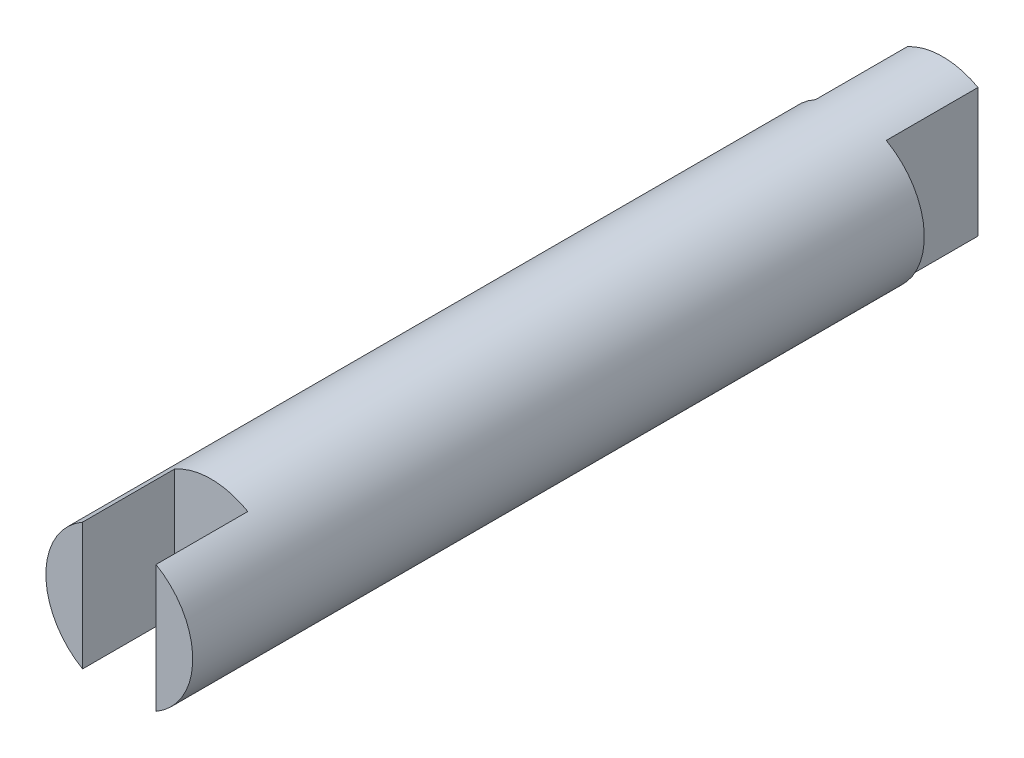
ISO-10303-21;
HEADER;
FILE_DESCRIPTION(('STEP AP214'),'2;1');
FILE_NAME('part.step','',(''),(''),'','','');
FILE_SCHEMA(('AUTOMOTIVE_DESIGN { 1 0 10303 214 1 1 1 1 }'));
ENDSEC;
DATA;
#1=APPLICATION_CONTEXT('core data for automotive mechanical design processes');
#2=APPLICATION_PROTOCOL_DEFINITION('international standard','automotive_design',2000,#1);
#3=PRODUCT_CONTEXT('',#1,'mechanical');
#4=PRODUCT('Part','Part','',(#3));
#5=PRODUCT_RELATED_PRODUCT_CATEGORY('part','',(#4));
#6=PRODUCT_DEFINITION_FORMATION('','',#4);
#7=PRODUCT_DEFINITION_CONTEXT('part definition',#1,'design');
#8=PRODUCT_DEFINITION('design','',#6,#7);
#9=PRODUCT_DEFINITION_SHAPE('','',#8);
#10=(LENGTH_UNIT() NAMED_UNIT(*) SI_UNIT(.MILLI.,.METRE.));
#11=(NAMED_UNIT(*) PLANE_ANGLE_UNIT() SI_UNIT($,.RADIAN.));
#12=(NAMED_UNIT(*) SI_UNIT($,.STERADIAN.) SOLID_ANGLE_UNIT());
#13=UNCERTAINTY_MEASURE_WITH_UNIT(LENGTH_MEASURE(1.E-05),#10,'distance_accuracy_value','');
#14=(GEOMETRIC_REPRESENTATION_CONTEXT(3) GLOBAL_UNCERTAINTY_ASSIGNED_CONTEXT((#13)) GLOBAL_UNIT_ASSIGNED_CONTEXT((#10,
#11,#12)) REPRESENTATION_CONTEXT('',''));
#15=CARTESIAN_POINT('',(0.,0.,0.));
#16=DIRECTION('',(0.,0.,1.));
#17=DIRECTION('',(1.,0.,0.));
#18=AXIS2_PLACEMENT_3D('',#15,#16,#17);
#19=CARTESIAN_POINT('',(0.,0.,0.));
#20=DIRECTION('',(0.,0.,1.));
#21=DIRECTION('',(1.,0.,0.));
#22=AXIS2_PLACEMENT_3D('',#19,#20,#21);
#23=PLANE('',#22);
#24=CARTESIAN_POINT('',(0.,0.,0.));
#25=DIRECTION('',(0.,0.,1.));
#26=DIRECTION('',(1.,0.,0.));
#27=AXIS2_PLACEMENT_3D('',#24,#25,#26);
#28=CIRCLE('',#27,4.);
#29=CARTESIAN_POINT('',(-2.,-3.46410161513775,0.));
#30=VERTEX_POINT('',#29);
#31=CARTESIAN_POINT('',(2.,-3.46410161513775,0.));
#32=VERTEX_POINT('',#31);
#33=EDGE_CURVE('E49',#30,#32,#28,.T.);
#34=ORIENTED_EDGE('',*,*,#33,.T.);
#35=DIRECTION('',(0.,-1.,0.));
#36=VECTOR('',#35,1.);
#37=CARTESIAN_POINT('',(2.,3.46410161513775,0.));
#38=LINE('',#37,#36);
#39=CARTESIAN_POINT('',(2.,3.46410161513775,0.));
#40=VERTEX_POINT('',#39);
#41=EDGE_CURVE('E128',#40,#32,#38,.T.);
#42=ORIENTED_EDGE('',*,*,#41,.F.);
#43=CARTESIAN_POINT('',(-2.,3.46410161513775,0.));
#44=VERTEX_POINT('',#43);
#45=EDGE_CURVE('E166',#40,#44,#28,.T.);
#46=ORIENTED_EDGE('',*,*,#45,.T.);
#47=DIRECTION('',(0.,1.,0.));
#48=VECTOR('',#47,1.);
#49=CARTESIAN_POINT('',(-2.,3.46410161513775,0.));
#50=LINE('',#49,#48);
#51=EDGE_CURVE('E153',#30,#44,#50,.T.);
#52=ORIENTED_EDGE('',*,*,#51,.F.);
#53=EDGE_LOOP('',(#34,#42,#46,#52));
#54=FACE_BOUND('',#53,.T.);
#55=ADVANCED_FACE('F45',(#54),#23,.T.);
#56=CARTESIAN_POINT('',(0.,0.,-39.85));
#57=DIRECTION('',(0.,0.,1.));
#58=DIRECTION('',(1.,0.,0.));
#59=AXIS2_PLACEMENT_3D('',#56,#57,#58);
#60=CYLINDRICAL_SURFACE('',#59,4.);
#61=DIRECTION('',(0.,0.,-1.));
#62=VECTOR('',#61,1.);
#63=CARTESIAN_POINT('',(1.925,-3.50633355515416,-34.85));
#64=LINE('',#63,#62);
#65=CARTESIAN_POINT('',(1.925,-3.50633355515416,-34.85));
#66=VERTEX_POINT('',#65);
#67=CARTESIAN_POINT('',(1.925,-3.50633355515416,-39.85));
#68=VERTEX_POINT('',#67);
#69=EDGE_CURVE('E61',#66,#68,#64,.T.);
#70=ORIENTED_EDGE('',*,*,#69,.F.);
#71=CARTESIAN_POINT('',(0.,0.,-34.85));
#72=DIRECTION('',(0.,0.,-1.));
#73=DIRECTION('',(-1.,0.,0.));
#74=AXIS2_PLACEMENT_3D('',#71,#72,#73);
#75=CIRCLE('',#74,4.);
#76=CARTESIAN_POINT('',(1.925,3.50633355515416,-34.85));
#77=VERTEX_POINT('',#76);
#78=EDGE_CURVE('E113',#77,#66,#75,.T.);
#79=ORIENTED_EDGE('',*,*,#78,.F.);
#80=DIRECTION('',(0.,0.,-1.));
#81=VECTOR('',#80,1.);
#82=CARTESIAN_POINT('',(1.925,3.50633355515416,-34.85));
#83=LINE('',#82,#81);
#84=CARTESIAN_POINT('',(1.925,3.50633355515416,-39.85));
#85=VERTEX_POINT('',#84);
#86=EDGE_CURVE('E121',#77,#85,#83,.T.);
#87=ORIENTED_EDGE('',*,*,#86,.T.);
#88=CARTESIAN_POINT('',(0.,0.,-39.85));
#89=DIRECTION('',(0.,0.,1.));
#90=DIRECTION('',(1.,0.,0.));
#91=AXIS2_PLACEMENT_3D('',#88,#89,#90);
#92=CIRCLE('',#91,4.);
#93=CARTESIAN_POINT('',(-1.925,3.50633355515416,-39.85));
#94=VERTEX_POINT('',#93);
#95=EDGE_CURVE('E12',#85,#94,#92,.T.);
#96=ORIENTED_EDGE('',*,*,#95,.T.);
#97=DIRECTION('',(0.,0.,-1.));
#98=VECTOR('',#97,1.);
#99=CARTESIAN_POINT('',(-1.925,3.50633355515416,-34.85));
#100=LINE('',#99,#98);
#101=CARTESIAN_POINT('',(-1.925,3.50633355515416,-34.85));
#102=VERTEX_POINT('',#101);
#103=EDGE_CURVE('E69',#102,#94,#100,.T.);
#104=ORIENTED_EDGE('',*,*,#103,.F.);
#105=CARTESIAN_POINT('',(0.,0.,-34.85));
#106=DIRECTION('',(0.,0.,-1.));
#107=DIRECTION('',(-1.,0.,0.));
#108=AXIS2_PLACEMENT_3D('',#105,#106,#107);
#109=CIRCLE('',#108,4.);
#110=CARTESIAN_POINT('',(-1.925,-3.50633355515416,-34.85));
#111=VERTEX_POINT('',#110);
#112=EDGE_CURVE('E138',#111,#102,#109,.T.);
#113=ORIENTED_EDGE('',*,*,#112,.F.);
#114=DIRECTION('',(0.,0.,-1.));
#115=VECTOR('',#114,1.);
#116=CARTESIAN_POINT('',(-1.925,-3.50633355515416,-34.85));
#117=LINE('',#116,#115);
#118=CARTESIAN_POINT('',(-1.925,-3.50633355515416,-39.85));
#119=VERTEX_POINT('',#118);
#120=EDGE_CURVE('E134',#111,#119,#117,.T.);
#121=ORIENTED_EDGE('',*,*,#120,.T.);
#122=EDGE_CURVE('E54',#119,#68,#92,.T.);
#123=ORIENTED_EDGE('',*,*,#122,.T.);
#124=EDGE_LOOP('',(#70,#79,#87,#96,#104,#113,#121,#123));
#125=FACE_BOUND('',#124,.T.);
#126=ORIENTED_EDGE('',*,*,#33,.F.);
#127=DIRECTION('',(0.,0.,-1.));
#128=VECTOR('',#127,1.);
#129=CARTESIAN_POINT('',(-2.,-3.46410161513775,5.));
#130=LINE('',#129,#128);
#131=CARTESIAN_POINT('',(-2.,-3.46410161513775,5.));
#132=VERTEX_POINT('',#131);
#133=EDGE_CURVE('E164',#132,#30,#130,.T.);
#134=ORIENTED_EDGE('',*,*,#133,.F.);
#135=CARTESIAN_POINT('',(0.,0.,5.));
#136=DIRECTION('',(0.,0.,1.));
#137=DIRECTION('',(1.,0.,0.));
#138=AXIS2_PLACEMENT_3D('',#135,#136,#137);
#139=CIRCLE('',#138,4.);
#140=CARTESIAN_POINT('',(-2.,3.46410161513775,5.));
#141=VERTEX_POINT('',#140);
#142=EDGE_CURVE('E154',#141,#132,#139,.T.);
#143=ORIENTED_EDGE('',*,*,#142,.F.);
#144=DIRECTION('',(0.,0.,-1.));
#145=VECTOR('',#144,1.);
#146=CARTESIAN_POINT('',(-2.,3.46410161513775,5.));
#147=LINE('',#146,#145);
#148=EDGE_CURVE('E159',#141,#44,#147,.T.);
#149=ORIENTED_EDGE('',*,*,#148,.T.);
#150=ORIENTED_EDGE('',*,*,#45,.F.);
#151=DIRECTION('',(0.,0.,-1.));
#152=VECTOR('',#151,1.);
#153=CARTESIAN_POINT('',(2.,3.46410161513775,5.));
#154=LINE('',#153,#152);
#155=CARTESIAN_POINT('',(2.,3.46410161513775,5.));
#156=VERTEX_POINT('',#155);
#157=EDGE_CURVE('E151',#156,#40,#154,.T.);
#158=ORIENTED_EDGE('',*,*,#157,.F.);
#159=CARTESIAN_POINT('',(0.,0.,5.));
#160=DIRECTION('',(0.,0.,1.));
#161=DIRECTION('',(1.,0.,0.));
#162=AXIS2_PLACEMENT_3D('',#159,#160,#161);
#163=CIRCLE('',#162,4.);
#164=CARTESIAN_POINT('',(2.,-3.46410161513775,5.));
#165=VERTEX_POINT('',#164);
#166=EDGE_CURVE('E142',#165,#156,#163,.T.);
#167=ORIENTED_EDGE('',*,*,#166,.F.);
#168=DIRECTION('',(0.,0.,-1.));
#169=VECTOR('',#168,1.);
#170=CARTESIAN_POINT('',(2.,-3.46410161513775,5.));
#171=LINE('',#170,#169);
#172=EDGE_CURVE('E147',#165,#32,#171,.T.);
#173=ORIENTED_EDGE('',*,*,#172,.T.);
#174=EDGE_LOOP('',(#126,#134,#143,#149,#150,#158,#167,#173));
#175=FACE_BOUND('',#174,.T.);
#176=ADVANCED_FACE('F47',(#125,#175),#60,.T.);
#177=CARTESIAN_POINT('',(0.,0.,-39.85));
#178=DIRECTION('',(0.,0.,1.));
#179=DIRECTION('',(1.,0.,0.));
#180=AXIS2_PLACEMENT_3D('',#177,#178,#179);
#181=PLANE('',#180);
#182=ORIENTED_EDGE('',*,*,#95,.F.);
#183=DIRECTION('',(0.,1.,0.));
#184=VECTOR('',#183,1.);
#185=CARTESIAN_POINT('',(1.925,3.50633355515416,-39.85));
#186=LINE('',#185,#184);
#187=EDGE_CURVE('E118',#68,#85,#186,.T.);
#188=ORIENTED_EDGE('',*,*,#187,.F.);
#189=ORIENTED_EDGE('',*,*,#122,.F.);
#190=DIRECTION('',(0.,-1.,0.));
#191=VECTOR('',#190,1.);
#192=CARTESIAN_POINT('',(-1.925,3.50633355515416,-39.85));
#193=LINE('',#192,#191);
#194=EDGE_CURVE('E136',#94,#119,#193,.T.);
#195=ORIENTED_EDGE('',*,*,#194,.F.);
#196=EDGE_LOOP('',(#182,#188,#189,#195));
#197=FACE_BOUND('',#196,.T.);
#198=ADVANCED_FACE('F192',(#197),#181,.F.);
#199=CARTESIAN_POINT('',(-2.,3.46410161513775,5.));
#200=DIRECTION('',(-1.,0.,0.));
#201=DIRECTION('',(0.,0.,1.));
#202=AXIS2_PLACEMENT_3D('',#199,#200,#201);
#203=PLANE('',#202);
#204=ORIENTED_EDGE('',*,*,#51,.T.);
#205=ORIENTED_EDGE('',*,*,#148,.F.);
#206=DIRECTION('',(0.,1.,0.));
#207=VECTOR('',#206,1.);
#208=CARTESIAN_POINT('',(-2.,3.46410161513775,5.));
#209=LINE('',#208,#207);
#210=EDGE_CURVE('E157',#132,#141,#209,.T.);
#211=ORIENTED_EDGE('',*,*,#210,.F.);
#212=ORIENTED_EDGE('',*,*,#133,.T.);
#213=EDGE_LOOP('',(#204,#205,#211,#212));
#214=FACE_BOUND('',#213,.T.);
#215=ADVANCED_FACE('F181',(#214),#203,.F.);
#216=CARTESIAN_POINT('',(0.,0.,5.));
#217=DIRECTION('',(0.,0.,1.));
#218=DIRECTION('',(1.,0.,0.));
#219=AXIS2_PLACEMENT_3D('',#216,#217,#218);
#220=PLANE('',#219);
#221=ORIENTED_EDGE('',*,*,#142,.T.);
#222=ORIENTED_EDGE('',*,*,#210,.T.);
#223=EDGE_LOOP('',(#221,#222));
#224=FACE_BOUND('',#223,.T.);
#225=ADVANCED_FACE('F183',(#224),#220,.T.);
#226=CARTESIAN_POINT('',(2.,3.46410161513775,5.));
#227=DIRECTION('',(1.,0.,0.));
#228=DIRECTION('',(0.,0.,-1.));
#229=AXIS2_PLACEMENT_3D('',#226,#227,#228);
#230=PLANE('',#229);
#231=ORIENTED_EDGE('',*,*,#41,.T.);
#232=ORIENTED_EDGE('',*,*,#172,.F.);
#233=DIRECTION('',(0.,-1.,0.));
#234=VECTOR('',#233,1.);
#235=CARTESIAN_POINT('',(2.,3.46410161513775,5.));
#236=LINE('',#235,#234);
#237=EDGE_CURVE('E145',#156,#165,#236,.T.);
#238=ORIENTED_EDGE('',*,*,#237,.F.);
#239=ORIENTED_EDGE('',*,*,#157,.T.);
#240=EDGE_LOOP('',(#231,#232,#238,#239));
#241=FACE_BOUND('',#240,.T.);
#242=ADVANCED_FACE('F179',(#241),#230,.F.);
#243=CARTESIAN_POINT('',(0.,0.,5.));
#244=DIRECTION('',(0.,0.,1.));
#245=DIRECTION('',(1.,0.,0.));
#246=AXIS2_PLACEMENT_3D('',#243,#244,#245);
#247=PLANE('',#246);
#248=ORIENTED_EDGE('',*,*,#166,.T.);
#249=ORIENTED_EDGE('',*,*,#237,.T.);
#250=EDGE_LOOP('',(#248,#249));
#251=FACE_BOUND('',#250,.T.);
#252=ADVANCED_FACE('F190',(#251),#247,.T.);
#253=CARTESIAN_POINT('',(-1.925,3.50633355515416,-34.85));
#254=DIRECTION('',(1.,0.,0.));
#255=DIRECTION('',(0.,0.,-1.));
#256=AXIS2_PLACEMENT_3D('',#253,#254,#255);
#257=PLANE('',#256);
#258=ORIENTED_EDGE('',*,*,#194,.T.);
#259=ORIENTED_EDGE('',*,*,#120,.F.);
#260=DIRECTION('',(0.,-1.,0.));
#261=VECTOR('',#260,1.);
#262=CARTESIAN_POINT('',(-1.925,3.50633355515416,-34.85));
#263=LINE('',#262,#261);
#264=EDGE_CURVE('E133',#102,#111,#263,.T.);
#265=ORIENTED_EDGE('',*,*,#264,.F.);
#266=ORIENTED_EDGE('',*,*,#103,.T.);
#267=EDGE_LOOP('',(#258,#259,#265,#266));
#268=FACE_BOUND('',#267,.T.);
#269=ADVANCED_FACE('F208',(#268),#257,.F.);
#270=CARTESIAN_POINT('',(0.,0.,-34.85));
#271=DIRECTION('',(0.,0.,-1.));
#272=DIRECTION('',(-1.,0.,0.));
#273=AXIS2_PLACEMENT_3D('',#270,#271,#272);
#274=PLANE('',#273);
#275=ORIENTED_EDGE('',*,*,#112,.T.);
#276=ORIENTED_EDGE('',*,*,#264,.T.);
#277=EDGE_LOOP('',(#275,#276));
#278=FACE_BOUND('',#277,.T.);
#279=ADVANCED_FACE('F207',(#278),#274,.T.);
#280=CARTESIAN_POINT('',(1.925,3.50633355515416,-34.85));
#281=DIRECTION('',(-1.,0.,0.));
#282=DIRECTION('',(0.,0.,1.));
#283=AXIS2_PLACEMENT_3D('',#280,#281,#282);
#284=PLANE('',#283);
#285=ORIENTED_EDGE('',*,*,#187,.T.);
#286=ORIENTED_EDGE('',*,*,#86,.F.);
#287=DIRECTION('',(0.,1.,0.));
#288=VECTOR('',#287,1.);
#289=CARTESIAN_POINT('',(1.925,3.50633355515416,-34.85));
#290=LINE('',#289,#288);
#291=EDGE_CURVE('E115',#66,#77,#290,.T.);
#292=ORIENTED_EDGE('',*,*,#291,.F.);
#293=ORIENTED_EDGE('',*,*,#69,.T.);
#294=EDGE_LOOP('',(#285,#286,#292,#293));
#295=FACE_BOUND('',#294,.T.);
#296=ADVANCED_FACE('F120',(#295),#284,.F.);
#297=CARTESIAN_POINT('',(0.,0.,-34.85));
#298=DIRECTION('',(0.,0.,-1.));
#299=DIRECTION('',(-1.,0.,0.));
#300=AXIS2_PLACEMENT_3D('',#297,#298,#299);
#301=PLANE('',#300);
#302=ORIENTED_EDGE('',*,*,#78,.T.);
#303=ORIENTED_EDGE('',*,*,#291,.T.);
#304=EDGE_LOOP('',(#302,#303));
#305=FACE_BOUND('',#304,.T.);
#306=ADVANCED_FACE('F114',(#305),#301,.T.);
#307=CLOSED_SHELL('',(#55,#176,#198,#215,#225,#242,#252,#269,#279,#296,#306));
#308=MANIFOLD_SOLID_BREP('B2',#307);
#309=ADVANCED_BREP_SHAPE_REPRESENTATION('',(#18,#308),#14);
#310=SHAPE_DEFINITION_REPRESENTATION(#9,#309);
ENDSEC;
END-ISO-10303-21;
